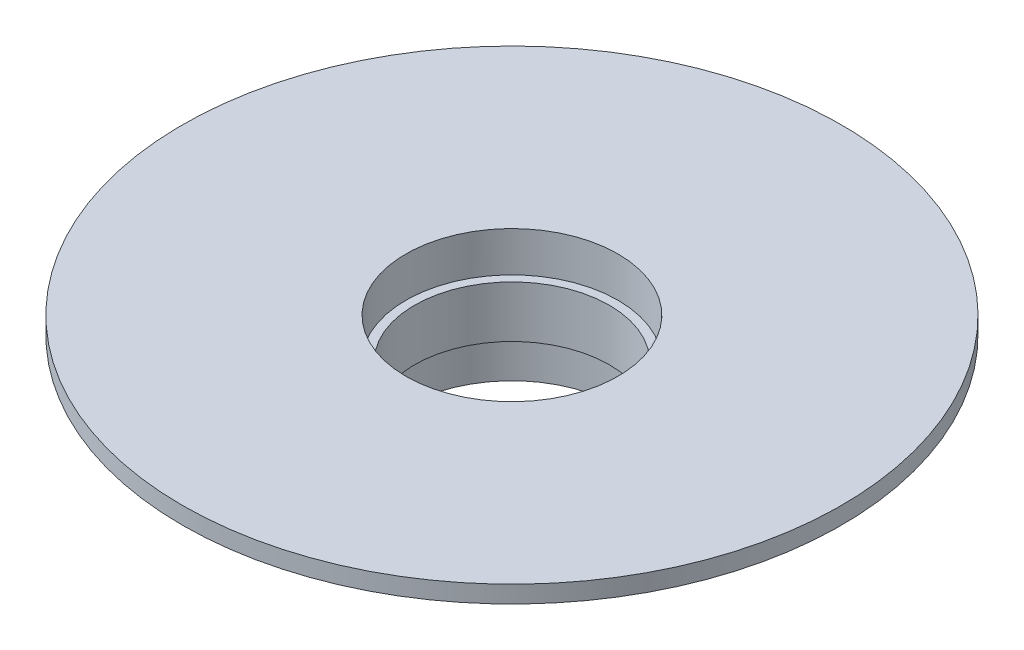
ISO-10303-21;
HEADER;
FILE_DESCRIPTION(('STEP AP214'),'2;1');
FILE_NAME('part.step','',(''),(''),'','','');
FILE_SCHEMA(('AUTOMOTIVE_DESIGN { 1 0 10303 214 1 1 1 1 }'));
ENDSEC;
DATA;
#1=APPLICATION_CONTEXT('core data for automotive mechanical design processes');
#2=APPLICATION_PROTOCOL_DEFINITION('international standard','automotive_design',2000,#1);
#3=PRODUCT_CONTEXT('',#1,'mechanical');
#4=PRODUCT('Part','Part','',(#3));
#5=PRODUCT_RELATED_PRODUCT_CATEGORY('part','',(#4));
#6=PRODUCT_DEFINITION_FORMATION('','',#4);
#7=PRODUCT_DEFINITION_CONTEXT('part definition',#1,'design');
#8=PRODUCT_DEFINITION('design','',#6,#7);
#9=PRODUCT_DEFINITION_SHAPE('','',#8);
#10=(LENGTH_UNIT() NAMED_UNIT(*) SI_UNIT(.MILLI.,.METRE.));
#11=(NAMED_UNIT(*) PLANE_ANGLE_UNIT() SI_UNIT($,.RADIAN.));
#12=(NAMED_UNIT(*) SI_UNIT($,.STERADIAN.) SOLID_ANGLE_UNIT());
#13=UNCERTAINTY_MEASURE_WITH_UNIT(LENGTH_MEASURE(1.E-05),#10,'distance_accuracy_value','');
#14=(GEOMETRIC_REPRESENTATION_CONTEXT(3) GLOBAL_UNCERTAINTY_ASSIGNED_CONTEXT((#13)) GLOBAL_UNIT_ASSIGNED_CONTEXT((#10,
#11,#12)) REPRESENTATION_CONTEXT('',''));
#15=CARTESIAN_POINT('',(0.,0.,0.));
#16=DIRECTION('',(0.,0.,1.));
#17=DIRECTION('',(1.,0.,0.));
#18=AXIS2_PLACEMENT_3D('',#15,#16,#17);
#19=CARTESIAN_POINT('',(0.,3.,0.));
#20=DIRECTION('',(0.,-1.,0.));
#21=DIRECTION('',(0.,0.,-1.));
#22=AXIS2_PLACEMENT_3D('',#19,#20,#21);
#23=CYLINDRICAL_SURFACE('',#22,18.5);
#24=CARTESIAN_POINT('',(0.,3.,0.));
#25=DIRECTION('',(0.,1.,0.));
#26=DIRECTION('',(0.,0.,1.));
#27=AXIS2_PLACEMENT_3D('',#24,#25,#26);
#28=CIRCLE('',#27,18.5);
#29=CARTESIAN_POINT('',(0.,3.,18.5));
#30=VERTEX_POINT('',#29);
#31=EDGE_CURVE('E71',#30,#30,#28,.T.);
#32=ORIENTED_EDGE('',*,*,#31,.T.);
#33=EDGE_LOOP('',(#32));
#34=FACE_BOUND('',#33,.T.);
#35=CARTESIAN_POINT('',(0.,-4.,0.));
#36=DIRECTION('',(0.,-1.,0.));
#37=DIRECTION('',(0.,0.,-1.));
#38=AXIS2_PLACEMENT_3D('',#35,#36,#37);
#39=CIRCLE('',#38,18.5);
#40=CARTESIAN_POINT('',(0.,-4.,-18.5));
#41=VERTEX_POINT('',#40);
#42=EDGE_CURVE('E114',#41,#41,#39,.T.);
#43=ORIENTED_EDGE('',*,*,#42,.T.);
#44=EDGE_LOOP('',(#43));
#45=FACE_BOUND('',#44,.T.);
#46=ADVANCED_FACE('F49',(#34,#45),#23,.F.);
#47=CARTESIAN_POINT('',(0.,-2.,0.));
#48=DIRECTION('',(0.,-1.,0.));
#49=DIRECTION('',(0.,0.,-1.));
#50=AXIS2_PLACEMENT_3D('',#47,#48,#49);
#51=PLANE('',#50);
#52=CARTESIAN_POINT('',(0.,-2.,0.));
#53=DIRECTION('',(0.,-1.,0.));
#54=DIRECTION('',(0.,0.,-1.));
#55=AXIS2_PLACEMENT_3D('',#52,#53,#54);
#56=CIRCLE('',#55,45.);
#57=CARTESIAN_POINT('',(0.,-2.,-45.));
#58=VERTEX_POINT('',#57);
#59=EDGE_CURVE('E69',#58,#58,#56,.T.);
#60=ORIENTED_EDGE('',*,*,#59,.T.);
#61=EDGE_LOOP('',(#60));
#62=FACE_BOUND('',#61,.T.);
#63=CARTESIAN_POINT('',(0.,-2.,0.));
#64=DIRECTION('',(0.,-1.,0.));
#65=DIRECTION('',(0.,0.,-1.));
#66=AXIS2_PLACEMENT_3D('',#63,#64,#65);
#67=CIRCLE('',#66,21.);
#68=CARTESIAN_POINT('',(0.,-2.,-21.));
#69=VERTEX_POINT('',#68);
#70=EDGE_CURVE('E113',#69,#69,#67,.T.);
#71=ORIENTED_EDGE('',*,*,#70,.F.);
#72=EDGE_LOOP('',(#71));
#73=FACE_BOUND('',#72,.T.);
#74=ADVANCED_FACE('F87',(#62,#73),#51,.T.);
#75=CARTESIAN_POINT('',(0.,3.,0.));
#76=DIRECTION('',(0.,1.,0.));
#77=DIRECTION('',(0.,0.,1.));
#78=AXIS2_PLACEMENT_3D('',#75,#76,#77);
#79=PLANE('',#78);
#80=CARTESIAN_POINT('',(0.,3.,0.));
#81=DIRECTION('',(0.,1.,0.));
#82=DIRECTION('',(0.,0.,1.));
#83=AXIS2_PLACEMENT_3D('',#80,#81,#82);
#84=CIRCLE('',#83,57.5);
#85=CARTESIAN_POINT('',(0.,3.,57.5));
#86=VERTEX_POINT('',#85);
#87=EDGE_CURVE('E60',#86,#86,#84,.T.);
#88=ORIENTED_EDGE('',*,*,#87,.T.);
#89=EDGE_LOOP('',(#88));
#90=FACE_BOUND('',#89,.T.);
#91=ORIENTED_EDGE('',*,*,#31,.F.);
#92=EDGE_LOOP('',(#91));
#93=FACE_BOUND('',#92,.T.);
#94=ADVANCED_FACE('F79',(#90,#93),#79,.T.);
#95=CARTESIAN_POINT('',(0.,0.,0.));
#96=DIRECTION('',(0.,1.,0.));
#97=DIRECTION('',(0.,0.,1.));
#98=AXIS2_PLACEMENT_3D('',#95,#96,#97);
#99=PLANE('',#98);
#100=CARTESIAN_POINT('',(0.,0.,0.));
#101=DIRECTION('',(0.,-1.,0.));
#102=DIRECTION('',(0.,0.,-1.));
#103=AXIS2_PLACEMENT_3D('',#100,#101,#102);
#104=CIRCLE('',#103,45.);
#105=CARTESIAN_POINT('',(0.,0.,-45.));
#106=VERTEX_POINT('',#105);
#107=EDGE_CURVE('E56',#106,#106,#104,.T.);
#108=ORIENTED_EDGE('',*,*,#107,.F.);
#109=EDGE_LOOP('',(#108));
#110=FACE_BOUND('',#109,.T.);
#111=CARTESIAN_POINT('',(0.,0.,0.));
#112=DIRECTION('',(0.,1.,0.));
#113=DIRECTION('',(0.,0.,1.));
#114=AXIS2_PLACEMENT_3D('',#111,#112,#113);
#115=CIRCLE('',#114,57.5);
#116=CARTESIAN_POINT('',(0.,0.,57.5));
#117=VERTEX_POINT('',#116);
#118=EDGE_CURVE('E65',#117,#117,#115,.T.);
#119=ORIENTED_EDGE('',*,*,#118,.F.);
#120=EDGE_LOOP('',(#119));
#121=FACE_BOUND('',#120,.T.);
#122=ADVANCED_FACE('F77',(#110,#121),#99,.F.);
#123=CARTESIAN_POINT('',(0.,3.,0.));
#124=DIRECTION('',(0.,-1.,0.));
#125=DIRECTION('',(0.,0.,-1.));
#126=AXIS2_PLACEMENT_3D('',#123,#124,#125);
#127=CYLINDRICAL_SURFACE('',#126,57.5);
#128=ORIENTED_EDGE('',*,*,#87,.F.);
#129=EDGE_LOOP('',(#128));
#130=FACE_BOUND('',#129,.T.);
#131=ORIENTED_EDGE('',*,*,#118,.T.);
#132=EDGE_LOOP('',(#131));
#133=FACE_BOUND('',#132,.T.);
#134=ADVANCED_FACE('F51',(#130,#133),#127,.T.);
#135=CARTESIAN_POINT('',(0.,-13.,0.));
#136=DIRECTION('',(0.,-1.,0.));
#137=DIRECTION('',(0.,0.,-1.));
#138=AXIS2_PLACEMENT_3D('',#135,#136,#137);
#139=CIRCLE('',#138,18.5);
#140=CARTESIAN_POINT('',(0.,-13.,-18.5));
#141=VERTEX_POINT('',#140);
#142=EDGE_CURVE('E11',#141,#141,#139,.T.);
#143=ORIENTED_EDGE('',*,*,#142,.F.);
#144=EDGE_LOOP('',(#143));
#145=FACE_BOUND('',#144,.T.);
#146=CARTESIAN_POINT('',(0.,-20.,0.));
#147=DIRECTION('',(0.,-1.,0.));
#148=DIRECTION('',(0.,0.,-1.));
#149=AXIS2_PLACEMENT_3D('',#146,#147,#148);
#150=CIRCLE('',#149,18.5);
#151=CARTESIAN_POINT('',(0.,-20.,-18.5));
#152=VERTEX_POINT('',#151);
#153=EDGE_CURVE('E111',#152,#152,#150,.T.);
#154=ORIENTED_EDGE('',*,*,#153,.T.);
#155=EDGE_LOOP('',(#154));
#156=FACE_BOUND('',#155,.T.);
#157=ADVANCED_FACE('F85',(#145,#156),#23,.F.);
#158=CARTESIAN_POINT('',(0.,-2.,0.));
#159=DIRECTION('',(0.,1.,0.));
#160=DIRECTION('',(0.,0.,1.));
#161=AXIS2_PLACEMENT_3D('',#158,#159,#160);
#162=CYLINDRICAL_SURFACE('',#161,45.);
#163=ORIENTED_EDGE('',*,*,#59,.F.);
#164=EDGE_LOOP('',(#163));
#165=FACE_BOUND('',#164,.T.);
#166=ORIENTED_EDGE('',*,*,#107,.T.);
#167=EDGE_LOOP('',(#166));
#168=FACE_BOUND('',#167,.T.);
#169=ADVANCED_FACE('F101',(#165,#168),#162,.T.);
#170=CARTESIAN_POINT('',(0.,-20.,0.));
#171=DIRECTION('',(0.,-1.,0.));
#172=DIRECTION('',(0.,0.,-1.));
#173=AXIS2_PLACEMENT_3D('',#170,#171,#172);
#174=PLANE('',#173);
#175=CARTESIAN_POINT('',(0.,-20.,0.));
#176=DIRECTION('',(0.,-1.,0.));
#177=DIRECTION('',(0.,0.,-1.));
#178=AXIS2_PLACEMENT_3D('',#175,#176,#177);
#179=CIRCLE('',#178,21.);
#180=CARTESIAN_POINT('',(0.,-20.,-21.));
#181=VERTEX_POINT('',#180);
#182=EDGE_CURVE('E117',#181,#181,#179,.T.);
#183=ORIENTED_EDGE('',*,*,#182,.T.);
#184=EDGE_LOOP('',(#183));
#185=FACE_BOUND('',#184,.T.);
#186=ORIENTED_EDGE('',*,*,#153,.F.);
#187=EDGE_LOOP('',(#186));
#188=FACE_BOUND('',#187,.T.);
#189=ADVANCED_FACE('F106',(#185,#188),#174,.T.);
#190=CARTESIAN_POINT('',(0.,-20.,0.));
#191=DIRECTION('',(0.,1.,0.));
#192=DIRECTION('',(0.,0.,1.));
#193=AXIS2_PLACEMENT_3D('',#190,#191,#192);
#194=CYLINDRICAL_SURFACE('',#193,21.);
#195=ORIENTED_EDGE('',*,*,#182,.F.);
#196=EDGE_LOOP('',(#195));
#197=FACE_BOUND('',#196,.T.);
#198=ORIENTED_EDGE('',*,*,#70,.T.);
#199=EDGE_LOOP('',(#198));
#200=FACE_BOUND('',#199,.T.);
#201=ADVANCED_FACE('F131',(#197,#200),#194,.T.);
#202=CARTESIAN_POINT('',(0.,-4.,0.));
#203=DIRECTION('',(0.,-1.,0.));
#204=DIRECTION('',(0.,0.,-1.));
#205=AXIS2_PLACEMENT_3D('',#202,#203,#204);
#206=PLANE('',#205);
#207=CARTESIAN_POINT('',(0.,-4.,0.));
#208=DIRECTION('',(0.,-1.,0.));
#209=DIRECTION('',(0.,0.,-1.));
#210=AXIS2_PLACEMENT_3D('',#207,#208,#209);
#211=CIRCLE('',#210,17.);
#212=CARTESIAN_POINT('',(0.,-4.,-17.));
#213=VERTEX_POINT('',#212);
#214=EDGE_CURVE('E119',#213,#213,#211,.T.);
#215=ORIENTED_EDGE('',*,*,#214,.T.);
#216=EDGE_LOOP('',(#215));
#217=FACE_BOUND('',#216,.T.);
#218=ORIENTED_EDGE('',*,*,#42,.F.);
#219=EDGE_LOOP('',(#218));
#220=FACE_BOUND('',#219,.T.);
#221=ADVANCED_FACE('F133',(#217,#220),#206,.F.);
#222=CARTESIAN_POINT('',(0.,-13.,0.));
#223=DIRECTION('',(0.,-1.,0.));
#224=DIRECTION('',(0.,0.,-1.));
#225=AXIS2_PLACEMENT_3D('',#222,#223,#224);
#226=PLANE('',#225);
#227=CARTESIAN_POINT('',(0.,-13.,0.));
#228=DIRECTION('',(0.,-1.,0.));
#229=DIRECTION('',(0.,0.,-1.));
#230=AXIS2_PLACEMENT_3D('',#227,#228,#229);
#231=CIRCLE('',#230,17.);
#232=CARTESIAN_POINT('',(0.,-13.,-17.));
#233=VERTEX_POINT('',#232);
#234=EDGE_CURVE('E158',#233,#233,#231,.T.);
#235=ORIENTED_EDGE('',*,*,#234,.F.);
#236=EDGE_LOOP('',(#235));
#237=FACE_BOUND('',#236,.T.);
#238=ORIENTED_EDGE('',*,*,#142,.T.);
#239=EDGE_LOOP('',(#238));
#240=FACE_BOUND('',#239,.T.);
#241=ADVANCED_FACE('F140',(#237,#240),#226,.T.);
#242=CARTESIAN_POINT('',(0.,-4.,0.));
#243=DIRECTION('',(0.,-1.,0.));
#244=DIRECTION('',(0.,0.,-1.));
#245=AXIS2_PLACEMENT_3D('',#242,#243,#244);
#246=CYLINDRICAL_SURFACE('',#245,17.);
#247=ORIENTED_EDGE('',*,*,#214,.F.);
#248=EDGE_LOOP('',(#247));
#249=FACE_BOUND('',#248,.T.);
#250=ORIENTED_EDGE('',*,*,#234,.T.);
#251=EDGE_LOOP('',(#250));
#252=FACE_BOUND('',#251,.T.);
#253=ADVANCED_FACE('F146',(#249,#252),#246,.F.);
#254=CLOSED_SHELL('',(#46,#74,#94,#122,#134,#157,#169,#189,#201,#221,#241,#253));
#255=MANIFOLD_SOLID_BREP('B2',#254);
#256=ADVANCED_BREP_SHAPE_REPRESENTATION('',(#18,#255),#14);
#257=SHAPE_DEFINITION_REPRESENTATION(#9,#256);
ENDSEC;
END-ISO-10303-21;
